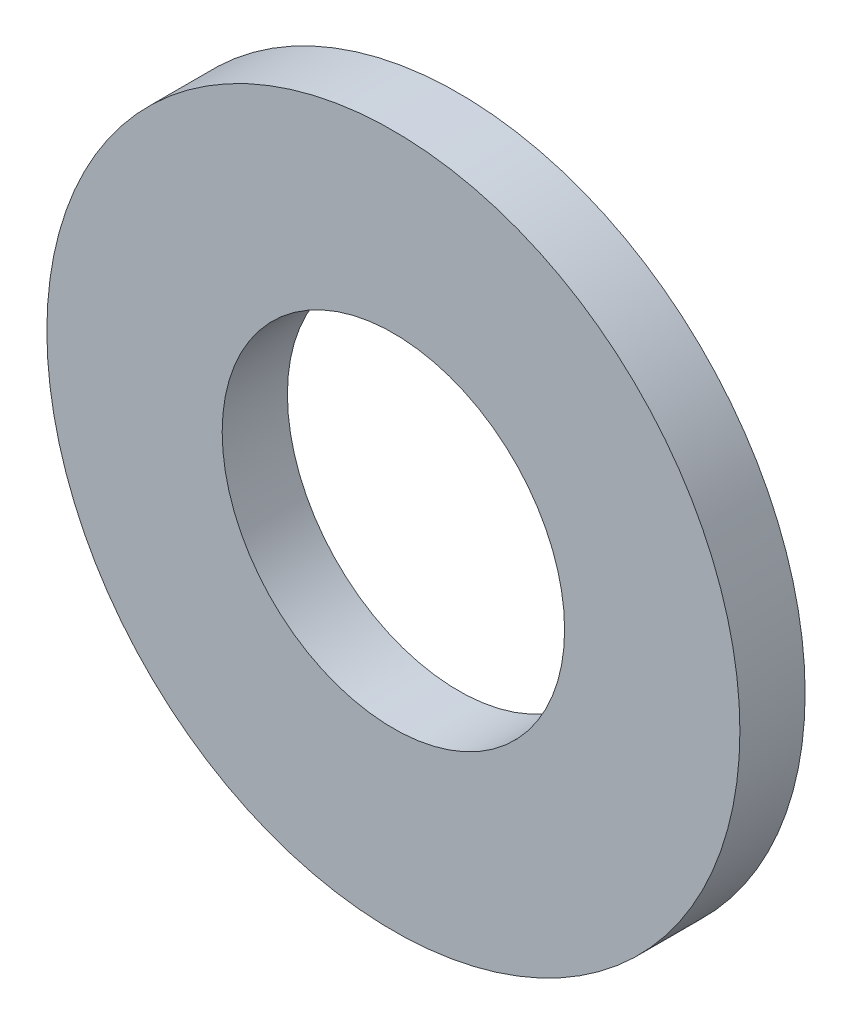
ISO-10303-21;
HEADER;
FILE_DESCRIPTION(('STEP AP214'),'2;1');
FILE_NAME('part.step','',(''),(''),'','','');
FILE_SCHEMA(('AUTOMOTIVE_DESIGN { 1 0 10303 214 1 1 1 1 }'));
ENDSEC;
DATA;
#1=APPLICATION_CONTEXT('core data for automotive mechanical design processes');
#2=APPLICATION_PROTOCOL_DEFINITION('international standard','automotive_design',2000,#1);
#3=PRODUCT_CONTEXT('',#1,'mechanical');
#4=PRODUCT('Part','Part','',(#3));
#5=PRODUCT_RELATED_PRODUCT_CATEGORY('part','',(#4));
#6=PRODUCT_DEFINITION_FORMATION('','',#4);
#7=PRODUCT_DEFINITION_CONTEXT('part definition',#1,'design');
#8=PRODUCT_DEFINITION('design','',#6,#7);
#9=PRODUCT_DEFINITION_SHAPE('','',#8);
#10=(LENGTH_UNIT() NAMED_UNIT(*) SI_UNIT(.MILLI.,.METRE.));
#11=(NAMED_UNIT(*) PLANE_ANGLE_UNIT() SI_UNIT($,.RADIAN.));
#12=(NAMED_UNIT(*) SI_UNIT($,.STERADIAN.) SOLID_ANGLE_UNIT());
#13=UNCERTAINTY_MEASURE_WITH_UNIT(LENGTH_MEASURE(1.E-05),#10,'distance_accuracy_value','');
#14=(GEOMETRIC_REPRESENTATION_CONTEXT(3) GLOBAL_UNCERTAINTY_ASSIGNED_CONTEXT((#13)) GLOBAL_UNIT_ASSIGNED_CONTEXT((#10,
#11,#12)) REPRESENTATION_CONTEXT('',''));
#15=CARTESIAN_POINT('',(0.,0.,0.));
#16=DIRECTION('',(0.,0.,1.));
#17=DIRECTION('',(1.,0.,0.));
#18=AXIS2_PLACEMENT_3D('',#15,#16,#17);
#19=CARTESIAN_POINT('',(0.,0.,1.6));
#20=DIRECTION('',(0.,0.,1.));
#21=DIRECTION('',(1.,0.,0.));
#22=AXIS2_PLACEMENT_3D('',#19,#20,#21);
#23=PLANE('',#22);
#24=CARTESIAN_POINT('',(0.,0.,1.6));
#25=DIRECTION('',(0.,0.,1.));
#26=DIRECTION('',(1.,0.,0.));
#27=AXIS2_PLACEMENT_3D('',#24,#25,#26);
#28=CIRCLE('',#27,8.5);
#29=CARTESIAN_POINT('',(8.5,0.,1.6));
#30=VERTEX_POINT('',#29);
#31=EDGE_CURVE('E10',#30,#30,#28,.T.);
#32=ORIENTED_EDGE('',*,*,#31,.T.);
#33=EDGE_LOOP('',(#32));
#34=FACE_BOUND('',#33,.T.);
#35=CARTESIAN_POINT('',(0.,0.,1.6));
#36=DIRECTION('',(0.,0.,1.));
#37=DIRECTION('',(1.,0.,0.));
#38=AXIS2_PLACEMENT_3D('',#35,#36,#37);
#39=CIRCLE('',#38,4.2);
#40=CARTESIAN_POINT('',(4.2,0.,1.6));
#41=VERTEX_POINT('',#40);
#42=EDGE_CURVE('E38',#41,#41,#39,.T.);
#43=ORIENTED_EDGE('',*,*,#42,.F.);
#44=EDGE_LOOP('',(#43));
#45=FACE_BOUND('',#44,.T.);
#46=ADVANCED_FACE('F27',(#34,#45),#23,.T.);
#47=CARTESIAN_POINT('',(0.,0.,0.));
#48=DIRECTION('',(0.,0.,1.));
#49=DIRECTION('',(1.,0.,0.));
#50=AXIS2_PLACEMENT_3D('',#47,#48,#49);
#51=PLANE('',#50);
#52=CARTESIAN_POINT('',(0.,0.,0.));
#53=DIRECTION('',(0.,0.,1.));
#54=DIRECTION('',(1.,0.,0.));
#55=AXIS2_PLACEMENT_3D('',#52,#53,#54);
#56=CIRCLE('',#55,8.5);
#57=CARTESIAN_POINT('',(8.5,0.,0.));
#58=VERTEX_POINT('',#57);
#59=EDGE_CURVE('E34',#58,#58,#56,.T.);
#60=ORIENTED_EDGE('',*,*,#59,.F.);
#61=EDGE_LOOP('',(#60));
#62=FACE_BOUND('',#61,.T.);
#63=CARTESIAN_POINT('',(0.,0.,0.));
#64=DIRECTION('',(0.,0.,1.));
#65=DIRECTION('',(1.,0.,0.));
#66=AXIS2_PLACEMENT_3D('',#63,#64,#65);
#67=CIRCLE('',#66,4.2);
#68=CARTESIAN_POINT('',(4.2,0.,0.));
#69=VERTEX_POINT('',#68);
#70=EDGE_CURVE('E42',#69,#69,#67,.T.);
#71=ORIENTED_EDGE('',*,*,#70,.T.);
#72=EDGE_LOOP('',(#71));
#73=FACE_BOUND('',#72,.T.);
#74=ADVANCED_FACE('F48',(#62,#73),#51,.F.);
#75=CARTESIAN_POINT('',(0.,0.,1.6));
#76=DIRECTION('',(0.,0.,-1.));
#77=DIRECTION('',(-1.,0.,0.));
#78=AXIS2_PLACEMENT_3D('',#75,#76,#77);
#79=CYLINDRICAL_SURFACE('',#78,8.5);
#80=ORIENTED_EDGE('',*,*,#31,.F.);
#81=EDGE_LOOP('',(#80));
#82=FACE_BOUND('',#81,.T.);
#83=ORIENTED_EDGE('',*,*,#59,.T.);
#84=EDGE_LOOP('',(#83));
#85=FACE_BOUND('',#84,.T.);
#86=ADVANCED_FACE('F29',(#82,#85),#79,.T.);
#87=CARTESIAN_POINT('',(0.,0.,1.6));
#88=DIRECTION('',(0.,0.,-1.));
#89=DIRECTION('',(-1.,0.,0.));
#90=AXIS2_PLACEMENT_3D('',#87,#88,#89);
#91=CYLINDRICAL_SURFACE('',#90,4.2);
#92=ORIENTED_EDGE('',*,*,#42,.T.);
#93=EDGE_LOOP('',(#92));
#94=FACE_BOUND('',#93,.T.);
#95=ORIENTED_EDGE('',*,*,#70,.F.);
#96=EDGE_LOOP('',(#95));
#97=FACE_BOUND('',#96,.T.);
#98=ADVANCED_FACE('F50',(#94,#97),#91,.F.);
#99=CLOSED_SHELL('',(#46,#74,#86,#98));
#100=MANIFOLD_SOLID_BREP('B2',#99);
#101=ADVANCED_BREP_SHAPE_REPRESENTATION('',(#18,#100),#14);
#102=SHAPE_DEFINITION_REPRESENTATION(#9,#101);
ENDSEC;
END-ISO-10303-21;
